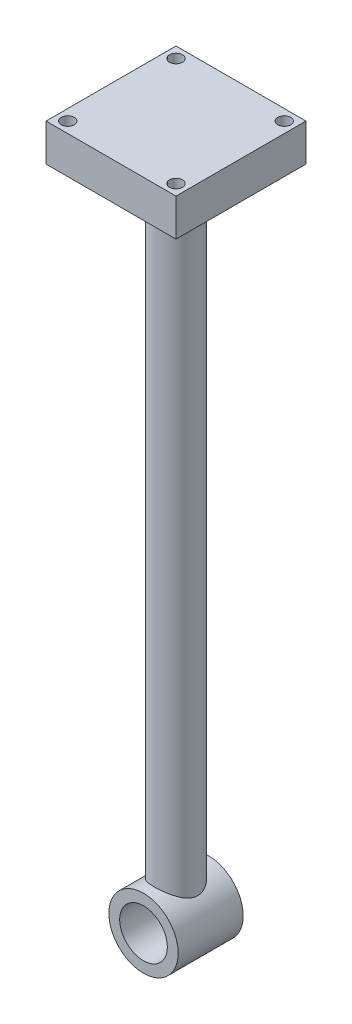
ISO-10303-21;
HEADER;
FILE_DESCRIPTION(('STEP AP214'),'2;1');
FILE_NAME('part.step','',(''),(''),'','','');
FILE_SCHEMA(('AUTOMOTIVE_DESIGN { 1 0 10303 214 1 1 1 1 }'));
ENDSEC;
DATA;
#1=APPLICATION_CONTEXT('core data for automotive mechanical design processes');
#2=APPLICATION_PROTOCOL_DEFINITION('international standard','automotive_design',2000,#1);
#3=PRODUCT_CONTEXT('',#1,'mechanical');
#4=PRODUCT('Part','Part','',(#3));
#5=PRODUCT_RELATED_PRODUCT_CATEGORY('part','',(#4));
#6=PRODUCT_DEFINITION_FORMATION('','',#4);
#7=PRODUCT_DEFINITION_CONTEXT('part definition',#1,'design');
#8=PRODUCT_DEFINITION('design','',#6,#7);
#9=PRODUCT_DEFINITION_SHAPE('','',#8);
#10=(LENGTH_UNIT() NAMED_UNIT(*) SI_UNIT(.MILLI.,.METRE.));
#11=(NAMED_UNIT(*) PLANE_ANGLE_UNIT() SI_UNIT($,.RADIAN.));
#12=(NAMED_UNIT(*) SI_UNIT($,.STERADIAN.) SOLID_ANGLE_UNIT());
#13=UNCERTAINTY_MEASURE_WITH_UNIT(LENGTH_MEASURE(1.E-05),#10,'distance_accuracy_value','');
#14=(GEOMETRIC_REPRESENTATION_CONTEXT(3) GLOBAL_UNCERTAINTY_ASSIGNED_CONTEXT((#13)) GLOBAL_UNIT_ASSIGNED_CONTEXT((#10,
#11,#12)) REPRESENTATION_CONTEXT('',''));
#15=CARTESIAN_POINT('',(0.,0.,0.));
#16=DIRECTION('',(0.,0.,1.));
#17=DIRECTION('',(1.,0.,0.));
#18=AXIS2_PLACEMENT_3D('',#15,#16,#17);
#19=CARTESIAN_POINT('',(0.,0.,7.5));
#20=DIRECTION('',(0.,0.,1.));
#21=DIRECTION('',(1.,0.,0.));
#22=AXIS2_PLACEMENT_3D('',#19,#20,#21);
#23=PLANE('',#22);
#24=CARTESIAN_POINT('',(0.,0.,7.5));
#25=DIRECTION('',(0.,0.,1.));
#26=DIRECTION('',(1.,0.,0.));
#27=AXIS2_PLACEMENT_3D('',#24,#25,#26);
#28=CIRCLE('',#27,8.);
#29=CARTESIAN_POINT('',(8.,0.,7.5));
#30=VERTEX_POINT('',#29);
#31=EDGE_CURVE('E11',#30,#30,#28,.T.);
#32=ORIENTED_EDGE('',*,*,#31,.T.);
#33=EDGE_LOOP('',(#32));
#34=FACE_BOUND('',#33,.T.);
#35=CARTESIAN_POINT('',(0.,0.,7.5));
#36=DIRECTION('',(0.,0.,1.));
#37=DIRECTION('',(1.,0.,0.));
#38=AXIS2_PLACEMENT_3D('',#35,#36,#37);
#39=CIRCLE('',#38,5.5);
#40=CARTESIAN_POINT('',(5.5,0.,7.5));
#41=VERTEX_POINT('',#40);
#42=EDGE_CURVE('E143',#41,#41,#39,.T.);
#43=ORIENTED_EDGE('',*,*,#42,.F.);
#44=EDGE_LOOP('',(#43));
#45=FACE_BOUND('',#44,.T.);
#46=ADVANCED_FACE('F39',(#34,#45),#23,.T.);
#47=CARTESIAN_POINT('',(0.,0.,-7.5));
#48=DIRECTION('',(0.,0.,1.));
#49=DIRECTION('',(1.,0.,0.));
#50=AXIS2_PLACEMENT_3D('',#47,#48,#49);
#51=PLANE('',#50);
#52=CARTESIAN_POINT('',(0.,0.,-7.5));
#53=DIRECTION('',(0.,0.,1.));
#54=DIRECTION('',(1.,0.,0.));
#55=AXIS2_PLACEMENT_3D('',#52,#53,#54);
#56=CIRCLE('',#55,8.);
#57=CARTESIAN_POINT('',(8.,0.,-7.5));
#58=VERTEX_POINT('',#57);
#59=EDGE_CURVE('E43',#58,#58,#56,.T.);
#60=ORIENTED_EDGE('',*,*,#59,.F.);
#61=EDGE_LOOP('',(#60));
#62=FACE_BOUND('',#61,.T.);
#63=CARTESIAN_POINT('',(0.,0.,-7.5));
#64=DIRECTION('',(0.,0.,1.));
#65=DIRECTION('',(1.,0.,0.));
#66=AXIS2_PLACEMENT_3D('',#63,#64,#65);
#67=CIRCLE('',#66,5.5);
#68=CARTESIAN_POINT('',(5.5,0.,-7.5));
#69=VERTEX_POINT('',#68);
#70=EDGE_CURVE('E142',#69,#69,#67,.T.);
#71=ORIENTED_EDGE('',*,*,#70,.T.);
#72=EDGE_LOOP('',(#71));
#73=FACE_BOUND('',#72,.T.);
#74=ADVANCED_FACE('F188',(#62,#73),#51,.F.);
#75=CARTESIAN_POINT('',(0.,0.,7.5));
#76=DIRECTION('',(0.,0.,-1.));
#77=DIRECTION('',(-1.,0.,0.));
#78=AXIS2_PLACEMENT_3D('',#75,#76,#77);
#79=CYLINDRICAL_SURFACE('',#78,8.);
#80=CARTESIAN_POINT('',(0.,8.,5.));
#81=CARTESIAN_POINT('',(0.127079718194144,7.99999969932037,4.999999703158));
#82=CARTESIAN_POINT('',(0.254165976353162,7.99696526438072,4.99514877169044));
#83=CARTESIAN_POINT('',(0.507365681398697,7.98490163345175,4.97581254301626));
#84=CARTESIAN_POINT('',(0.633478681463028,7.97586983252039,4.96132305932189));
#85=CARTESIAN_POINT('',(0.883879235580955,7.95201844653618,4.9228878347618));
#86=CARTESIAN_POINT('',(1.00816396386935,7.93719071559646,4.89892878436801));
#87=CARTESIAN_POINT('',(1.25388007858571,7.90210083284868,4.8418697843255));
#88=CARTESIAN_POINT('',(1.3753102342372,7.88183638204784,4.8087659675088));
#89=CARTESIAN_POINT('',(1.61383677448202,7.83646507337636,4.7340323987006));
#90=CARTESIAN_POINT('',(1.73095311667823,7.81138511664483,4.69244993505164));
#91=CARTESIAN_POINT('',(1.96091650164603,7.75685494898749,4.60110152475158));
#92=CARTESIAN_POINT('',(2.07376186971093,7.7274030455926,4.55133240807103));
#93=CARTESIAN_POINT('',(2.40491190911409,7.63340708241437,4.39050335799431));
#94=CARTESIAN_POINT('',(2.61609848167961,7.5631697348111,4.26783654975881));
#95=CARTESIAN_POINT('',(3.03193014433838,7.40680295707224,3.98444604696249));
#96=CARTESIAN_POINT('',(3.23470598963289,7.31985233528322,3.82146546344502));
#97=CARTESIAN_POINT('',(3.61195776992338,7.1412401292643,3.46710060830363));
#98=CARTESIAN_POINT('',(3.78639500697958,7.04957232454122,3.27567816902114));
#99=CARTESIAN_POINT('',(4.03551059577151,6.90836217121019,2.95571425020991));
#100=CARTESIAN_POINT('',(4.12074022592499,6.85772204075824,2.83571286902764));
#101=CARTESIAN_POINT('',(4.28074637131475,6.75899646823101,2.58784896365527));
#102=CARTESIAN_POINT('',(4.35552092872511,6.71091150568103,2.4599849735435));
#103=CARTESIAN_POINT('',(4.49385262588457,6.61907677956953,2.19711581232401));
#104=CARTESIAN_POINT('',(4.55742717693474,6.57532033426424,2.06212215723772));
#105=CARTESIAN_POINT('',(4.67278116226383,6.49385156056843,1.78537755230288));
#106=CARTESIAN_POINT('',(4.72456056034896,6.45613925072462,1.64362658172091));
#107=CARTESIAN_POINT('',(4.80367778250345,6.39737739560479,1.39186641707947));
#108=CARTESIAN_POINT('',(4.83387146386473,6.37454329188128,1.28316394558814));
#109=CARTESIAN_POINT('',(4.8869893698177,6.33391313113232,1.06308085312618));
#110=CARTESIAN_POINT('',(4.90991524122178,6.31611593289309,0.951700845020764));
#111=CARTESIAN_POINT('',(4.94817199977536,6.28619004435451,0.727023661660449));
#112=CARTESIAN_POINT('',(4.96351189515875,6.27405463174267,0.613728926331825));
#113=CARTESIAN_POINT('',(4.98640391146144,6.25587655110007,0.385858709185192));
#114=CARTESIAN_POINT('',(4.99395573327638,6.24983411707301,0.271283178348483));
#115=CARTESIAN_POINT('',(5.00115324292108,6.24407626191297,0.0414413461846044));
#116=CARTESIAN_POINT('',(5.00077951510321,6.24437637846302,-0.0738259597953579));
#117=CARTESIAN_POINT('',(4.99208386707443,6.2513301416873,-0.30390599351606));
#118=CARTESIAN_POINT('',(4.98375903270659,6.25798611784493,-0.418718539089884));
#119=CARTESIAN_POINT('',(4.95928874246478,6.27739584443856,-0.64702108197888));
#120=CARTESIAN_POINT('',(4.94314081984502,6.29015151819107,-0.760510650571557));
#121=CARTESIAN_POINT('',(4.90327193771259,6.32127805222651,-0.985386203178624));
#122=CARTESIAN_POINT('',(4.87954784440757,6.33965123599107,-1.09677129647281));
#123=CARTESIAN_POINT('',(4.79874186577055,6.40129934062341,-1.42161998429045));
#124=CARTESIAN_POINT('',(4.73140686716691,6.4516270932374,-1.63129247784869));
#125=CARTESIAN_POINT('',(4.57160139234777,6.565824165778,-2.03668208845984));
#126=CARTESIAN_POINT('',(4.47912202607653,6.62969827340046,-2.23239423873349));
#127=CARTESIAN_POINT('',(4.25180409904384,6.77818972806845,-2.64331465324919));
#128=CARTESIAN_POINT('',(4.1122797851601,6.86445305269834,-2.85533520228094));
#129=CARTESIAN_POINT('',(3.80349790123425,7.040239090172,-3.25534918374023));
#130=CARTESIAN_POINT('',(3.63420977102789,7.12976507734762,-3.44331757440197));
#131=CARTESIAN_POINT('',(3.34462792787133,7.26825220927601,-3.7195685480643));
#132=CARTESIAN_POINT('',(3.23332743959703,7.31856628212432,-3.81674280120393));
#133=CARTESIAN_POINT('',(3.00184758289934,7.4165140520612,-4.00135111278461));
#134=CARTESIAN_POINT('',(2.88167150233175,7.464148730294,-4.0887887482357));
#135=CARTESIAN_POINT('',(2.63291547069675,7.55548277586875,-4.25323322008513));
#136=CARTESIAN_POINT('',(2.50433330649266,7.59918109959603,-4.33023729302729));
#137=CARTESIAN_POINT('',(2.23953943503379,7.68138405457136,-4.47292528813083));
#138=CARTESIAN_POINT('',(2.10333250541061,7.71989188771747,-4.53861619614163));
#139=CARTESIAN_POINT('',(1.83158498937008,7.78870197133489,-4.65466886475307));
#140=CARTESIAN_POINT('',(1.69639792018988,7.81933279806533,-4.70566229777452));
#141=CARTESIAN_POINT('',(1.42097512774063,7.87404113157595,-4.79602098961896));
#142=CARTESIAN_POINT('',(1.28074233969552,7.89812238079521,-4.83539289010581));
#143=CARTESIAN_POINT('',(0.996484502868522,7.93899345279391,-4.90186739840658));
#144=CARTESIAN_POINT('',(0.852462989802589,7.95578983464414,-4.92898104411324));
#145=CARTESIAN_POINT('',(0.561915361707666,7.98157299247508,-4.97049034997301));
#146=CARTESIAN_POINT('',(0.415389678880742,7.99056110250213,-4.98488818263482));
#147=CARTESIAN_POINT('',(0.143238039189039,7.99969867025939,-4.999520164093));
#148=CARTESIAN_POINT('',(0.0177414078568131,8.00096292697891,-5.00154086408901));
#149=CARTESIAN_POINT('',(-0.232966367766397,7.99758945182604,-4.9961427784958));
#150=CARTESIAN_POINT('',(-0.358177530272757,7.9929521077216,-4.98872461309249));
#151=CARTESIAN_POINT('',(-0.607327834496613,7.97789005521255,-4.96455622247317));
#152=CARTESIAN_POINT('',(-0.731267089300075,7.96746586594014,-4.94780683435155));
#153=CARTESIAN_POINT('',(-0.976969695221644,7.94108300214141,-4.90520930732267));
#154=CARTESIAN_POINT('',(-1.09873300792335,7.92512423000295,-4.87936100793997));
#155=CARTESIAN_POINT('',(-1.33450834578852,7.88877344649023,-4.82009055280867));
#156=CARTESIAN_POINT('',(-1.44863666980924,7.86858112898481,-4.7870073558854));
#157=CARTESIAN_POINT('',(-1.67350231741757,7.82384532964923,-4.71311096735755));
#158=CARTESIAN_POINT('',(-1.78423846943478,7.79930036395891,-4.67229513929841));
#159=CARTESIAN_POINT('',(-2.11043845304158,7.7198451952159,-4.53885022306733));
#160=CARTESIAN_POINT('',(-2.32007565393525,7.65908557136377,-4.43517728812057));
#161=CARTESIAN_POINT('',(-2.74037159603304,7.51959499245698,-4.1899279363721));
#162=CARTESIAN_POINT('',(-2.94899750641245,7.43966908727208,-4.04558186341555));
#163=CARTESIAN_POINT('',(-3.34056091506499,7.27228030716763,-3.72882840333277));
#164=CARTESIAN_POINT('',(-3.52346945040511,7.1848091107345,-3.55638984261562));
#165=CARTESIAN_POINT('',(-3.88590040481163,6.99623419569616,-3.15945503308016));
#166=CARTESIAN_POINT('',(-4.06107692783136,6.89499476958427,-2.93103560865683));
#167=CARTESIAN_POINT('',(-4.37121122716532,6.70267107654715,-2.44451241557771));
#168=CARTESIAN_POINT('',(-4.50619684735976,6.61157980658315,-2.18642937021098));
#169=CARTESIAN_POINT('',(-4.70739703071134,6.46933988973206,-1.70118604230815));
#170=CARTESIAN_POINT('',(-4.78209607779641,6.41382106492076,-1.47888427189796));
#171=CARTESIAN_POINT('',(-4.87056932795047,6.34656596743547,-1.13643451168063));
#172=CARTESIAN_POINT('',(-4.89612834571373,6.32682054908637,-1.02080987665685));
#173=CARTESIAN_POINT('',(-4.93906627660446,6.29335959003546,-0.787213009902004));
#174=CARTESIAN_POINT('',(-4.95644870968554,6.27964145480505,-0.669241811186597));
#175=CARTESIAN_POINT('',(-4.98283345322303,6.25872646567769,-0.431062976531058));
#176=CARTESIAN_POINT('',(-4.99178464992502,6.25156939465669,-0.310846149194373));
#177=CARTESIAN_POINT('',(-5.00096567028373,6.24422754057757,-0.0698650772980854));
#178=CARTESIAN_POINT('',(-5.00119553239924,6.24404272677361,0.0508991648452125));
#179=CARTESIAN_POINT('',(-4.99292458618068,6.25065867247708,0.29197552581112));
#180=CARTESIAN_POINT('',(-4.98442112542226,6.2574615542391,0.412287496131265));
#181=CARTESIAN_POINT('',(-4.95884706925013,6.27774556876195,0.65139366298223));
#182=CARTESIAN_POINT('',(-4.94177659470706,6.2912266073017,0.770187880902528));
#183=CARTESIAN_POINT('',(-4.88153513763474,6.33822773980263,1.10397138997807));
#184=CARTESIAN_POINT('',(-4.82847742875036,6.37907576446225,1.3162377600251));
#185=CARTESIAN_POINT('',(-4.69670428935884,6.47669777004122,1.728579701154));
#186=CARTESIAN_POINT('',(-4.61797815957074,6.53347839071251,1.92865014730156));
#187=CARTESIAN_POINT('',(-4.42410573147435,6.66655793133305,2.34237556307301));
#188=CARTESIAN_POINT('',(-4.30533683658203,6.74449249142917,2.55380395596852));
#189=CARTESIAN_POINT('',(-4.04000963034607,6.90670498235136,2.9557507046809));
#190=CARTESIAN_POINT('',(-3.89342885237777,6.99098800808705,3.14625195760182));
#191=CARTESIAN_POINT('',(-3.54264024371939,7.17608994782601,3.54008396920719));
#192=CARTESIAN_POINT('',(-3.33276887019885,7.27687640364452,3.73847789009048));
#193=CARTESIAN_POINT('',(-2.99268031590093,7.42018359046303,4.00810023016021));
#194=CARTESIAN_POINT('',(-2.87498419390476,7.4666796252241,4.09337831825354));
#195=CARTESIAN_POINT('',(-2.63162062416605,7.55588019054725,4.25391486002553));
#196=CARTESIAN_POINT('',(-2.50595739502896,7.59858669939735,4.32917855200335));
#197=CARTESIAN_POINT('',(-2.24695585117553,7.67916888890582,4.46910627052635));
#198=CARTESIAN_POINT('',(-2.11359966396133,7.71703260409719,4.53374415122623));
#199=CARTESIAN_POINT('',(-1.8403912735063,7.78670745066037,4.65135006079645));
#200=CARTESIAN_POINT('',(-1.70054287903653,7.81852207637899,4.70432482984781));
#201=CARTESIAN_POINT('',(-1.415749691869,7.87506644788238,4.79771288731285));
#202=CARTESIAN_POINT('',(-1.27081981592251,7.89981525263675,4.83815999270725));
#203=CARTESIAN_POINT('',(-0.976912453464884,7.9415135957936,4.90595103285879));
#204=CARTESIAN_POINT('',(-0.827938038321416,7.95846888622183,4.93330463193523));
#205=CARTESIAN_POINT('',(-0.565708034628111,7.98076605772891,4.96918150103186));
#206=CARTESIAN_POINT('',(-0.453012043961128,7.98796542217808,4.98072550400174));
#207=CARTESIAN_POINT('',(-0.226879136348951,7.99758267549434,4.99613512360569));
#208=CARTESIAN_POINT('',(-0.113442173980088,8.00000026841223,5.00000026498644));
#209=CARTESIAN_POINT('',(0.,8.,5.));
#210=B_SPLINE_CURVE_WITH_KNOTS('',3,(#80,#81,#82,#83,#84,#85,#86,#87,#88,#89,#90,#91,#92,#93,
#94,#95,#96,#97,#98,#99,#100,#101,#102,#103,#104,#105,#106,#107,#108,#109,#110,#111,#112,#113,
#114,#115,#116,#117,#118,#119,#120,#121,#122,#123,#124,#125,#126,#127,#128,#129,#130,#131,#132,
#133,#134,#135,#136,#137,#138,#139,#140,#141,#142,#143,#144,#145,#146,#147,#148,#149,#150,#151,
#152,#153,#154,#155,#156,#157,#158,#159,#160,#161,#162,#163,#164,#165,#166,#167,#168,#169,#170,
#171,#172,#173,#174,#175,#176,#177,#178,#179,#180,#181,#182,#183,#184,#185,#186,#187,#188,#189,
#190,#191,#192,#193,#194,#195,#196,#197,#198,#199,#200,#201,#202,#203,#204,#205,#206,#207,#208,
#209),.UNSPECIFIED.,.T.,.F.,(4,2,2,2,2,2,2,2,2,2,2,2,2,2,2,2,2,2,2,2,2,2,2,2,2,2,2,2,2,2,2,2,2,
2,2,2,2,2,2,2,2,2,2,2,2,2,2,2,2,2,2,2,2,2,2,2,2,2,2,2,2,2,2,2,4),(0.,0.381122813878229,
0.762411275945245,1.14423755771083,1.52622555522555,1.90613865065076,2.2861992035346,
3.04547146930923,3.86537873527685,4.68639638614618,5.15288943324734,5.61946971957747,
6.08531814323784,6.55116799634915,6.89615022205285,7.24105422230075,7.58554766475416,
7.93005433713581,8.27540506342305,8.62088241265912,8.96646876744118,9.31219825544432,
9.98712845371038,10.6622975916544,11.463592889512,12.2657157783383,12.7334704505957,
13.2010527095967,13.6687585723722,14.1361745843372,14.5786070973028,15.0207862699487,
15.4625664873666,15.9042712116064,16.280349331717,16.6564027426817,17.0324224237136,
17.4084487368524,17.7696430642803,18.1309607639224,18.8530325398091,19.6479898222925,
20.4438353357779,21.355208937219,22.2659496705469,22.9857781952855,23.3455439181714,
23.705154622762,24.0669316687913,24.4287071194786,24.7905924786018,25.1524727320855,
25.8172983911075,26.482401522191,27.2437925511324,28.005801275804,28.9187931910577,
29.3761295657642,29.8332257699805,30.2914303932663,30.7493695182481,31.2060614935588,
31.6624158626753,32.0026174741983,32.3428401405226),.UNSPECIFIED.);
#211=CARTESIAN_POINT('',(0.,8.,5.));
#212=VERTEX_POINT('',#211);
#213=EDGE_CURVE('E133',#212,#212,#210,.T.);
#214=ORIENTED_EDGE('',*,*,#213,.F.);
#215=EDGE_LOOP('',(#214));
#216=FACE_BOUND('',#215,.T.);
#217=ORIENTED_EDGE('',*,*,#31,.F.);
#218=EDGE_LOOP('',(#217));
#219=FACE_BOUND('',#218,.T.);
#220=ORIENTED_EDGE('',*,*,#59,.T.);
#221=EDGE_LOOP('',(#220));
#222=FACE_BOUND('',#221,.T.);
#223=ADVANCED_FACE('F41',(#216,#219,#222),#79,.T.);
#224=CARTESIAN_POINT('',(0.,0.,7.5));
#225=DIRECTION('',(0.,0.,-1.));
#226=DIRECTION('',(-1.,0.,0.));
#227=AXIS2_PLACEMENT_3D('',#224,#225,#226);
#228=CYLINDRICAL_SURFACE('',#227,5.5);
#229=ORIENTED_EDGE('',*,*,#42,.T.);
#230=EDGE_LOOP('',(#229));
#231=FACE_BOUND('',#230,.T.);
#232=ORIENTED_EDGE('',*,*,#70,.F.);
#233=EDGE_LOOP('',(#232));
#234=FACE_BOUND('',#233,.T.);
#235=ADVANCED_FACE('F196',(#231,#234),#228,.F.);
#236=CARTESIAN_POINT('',(0.,-8.00100000000001,0.));
#237=DIRECTION('',(0.,1.,0.));
#238=DIRECTION('',(0.,0.,1.));
#239=AXIS2_PLACEMENT_3D('',#236,#237,#238);
#240=CYLINDRICAL_SURFACE('',#239,5.);
#241=CARTESIAN_POINT('',(0.,150.,0.));
#242=DIRECTION('',(0.,1.,0.));
#243=DIRECTION('',(0.,0.,1.));
#244=AXIS2_PLACEMENT_3D('',#241,#242,#243);
#245=CIRCLE('',#244,5.);
#246=CARTESIAN_POINT('',(0.,150.,5.));
#247=VERTEX_POINT('',#246);
#248=EDGE_CURVE('E117',#247,#247,#245,.T.);
#249=ORIENTED_EDGE('',*,*,#248,.F.);
#250=EDGE_LOOP('',(#249));
#251=FACE_BOUND('',#250,.T.);
#252=ORIENTED_EDGE('',*,*,#213,.T.);
#253=EDGE_LOOP('',(#252));
#254=FACE_BOUND('',#253,.T.);
#255=ADVANCED_FACE('F145',(#251,#254),#240,.T.);
#256=CARTESIAN_POINT('',(15.,201.037419011004,-15.));
#257=DIRECTION('',(-1.,0.,0.));
#258=DIRECTION('',(0.,0.,1.));
#259=AXIS2_PLACEMENT_3D('',#256,#257,#258);
#260=PLANE('',#259);
#261=DIRECTION('',(0.,0.,-1.));
#262=VECTOR('',#261,1.);
#263=CARTESIAN_POINT('',(15.,158.611012139811,-15.));
#264=LINE('',#263,#262);
#265=CARTESIAN_POINT('',(15.,158.611012139811,15.));
#266=VERTEX_POINT('',#265);
#267=CARTESIAN_POINT('',(15.,158.611012139811,-15.));
#268=VERTEX_POINT('',#267);
#269=EDGE_CURVE('E91',#266,#268,#264,.T.);
#270=ORIENTED_EDGE('',*,*,#269,.F.);
#271=DIRECTION('',(0.,-1.,0.));
#272=VECTOR('',#271,1.);
#273=CARTESIAN_POINT('',(15.,201.037419011004,15.));
#274=LINE('',#273,#272);
#275=CARTESIAN_POINT('',(15.,150.,15.));
#276=VERTEX_POINT('',#275);
#277=EDGE_CURVE('E55',#266,#276,#274,.T.);
#278=ORIENTED_EDGE('',*,*,#277,.T.);
#279=DIRECTION('',(0.,0.,-1.));
#280=VECTOR('',#279,1.);
#281=CARTESIAN_POINT('',(15.,150.,-15.));
#282=LINE('',#281,#280);
#283=CARTESIAN_POINT('',(15.,150.,-15.));
#284=VERTEX_POINT('',#283);
#285=EDGE_CURVE('E89',#276,#284,#282,.T.);
#286=ORIENTED_EDGE('',*,*,#285,.T.);
#287=DIRECTION('',(0.,-1.,0.));
#288=VECTOR('',#287,1.);
#289=CARTESIAN_POINT('',(15.,201.037419011004,-15.));
#290=LINE('',#289,#288);
#291=EDGE_CURVE('E78',#268,#284,#290,.T.);
#292=ORIENTED_EDGE('',*,*,#291,.F.);
#293=EDGE_LOOP('',(#270,#278,#286,#292));
#294=FACE_BOUND('',#293,.T.);
#295=ADVANCED_FACE('F87',(#294),#260,.F.);
#296=CARTESIAN_POINT('',(-15.,201.037419011004,-15.));
#297=DIRECTION('',(0.,0.,1.));
#298=DIRECTION('',(1.,0.,0.));
#299=AXIS2_PLACEMENT_3D('',#296,#297,#298);
#300=PLANE('',#299);
#301=DIRECTION('',(-1.,0.,0.));
#302=VECTOR('',#301,1.);
#303=CARTESIAN_POINT('',(-15.,158.611012139811,-15.));
#304=LINE('',#303,#302);
#305=CARTESIAN_POINT('',(-15.,158.611012139811,-15.));
#306=VERTEX_POINT('',#305);
#307=EDGE_CURVE('E84',#268,#306,#304,.T.);
#308=ORIENTED_EDGE('',*,*,#307,.F.);
#309=ORIENTED_EDGE('',*,*,#291,.T.);
#310=DIRECTION('',(-1.,0.,0.));
#311=VECTOR('',#310,1.);
#312=CARTESIAN_POINT('',(-15.,150.,-15.));
#313=LINE('',#312,#311);
#314=CARTESIAN_POINT('',(-15.,150.,-15.));
#315=VERTEX_POINT('',#314);
#316=EDGE_CURVE('E105',#284,#315,#313,.T.);
#317=ORIENTED_EDGE('',*,*,#316,.T.);
#318=DIRECTION('',(0.,-1.,0.));
#319=VECTOR('',#318,1.);
#320=CARTESIAN_POINT('',(-15.,201.037419011004,-15.));
#321=LINE('',#320,#319);
#322=EDGE_CURVE('E124',#306,#315,#321,.T.);
#323=ORIENTED_EDGE('',*,*,#322,.F.);
#324=EDGE_LOOP('',(#308,#309,#317,#323));
#325=FACE_BOUND('',#324,.T.);
#326=ADVANCED_FACE('F157',(#325),#300,.F.);
#327=CARTESIAN_POINT('',(-15.,201.037419011004,-15.));
#328=DIRECTION('',(1.,0.,0.));
#329=DIRECTION('',(0.,0.,-1.));
#330=AXIS2_PLACEMENT_3D('',#327,#328,#329);
#331=PLANE('',#330);
#332=DIRECTION('',(0.,0.,1.));
#333=VECTOR('',#332,1.);
#334=CARTESIAN_POINT('',(-15.,158.611012139811,-15.));
#335=LINE('',#334,#333);
#336=CARTESIAN_POINT('',(-15.,158.611012139811,15.));
#337=VERTEX_POINT('',#336);
#338=EDGE_CURVE('E113',#306,#337,#335,.T.);
#339=ORIENTED_EDGE('',*,*,#338,.F.);
#340=ORIENTED_EDGE('',*,*,#322,.T.);
#341=DIRECTION('',(0.,0.,1.));
#342=VECTOR('',#341,1.);
#343=CARTESIAN_POINT('',(-15.,150.,-15.));
#344=LINE('',#343,#342);
#345=CARTESIAN_POINT('',(-15.,150.,15.));
#346=VERTEX_POINT('',#345);
#347=EDGE_CURVE('E127',#315,#346,#344,.T.);
#348=ORIENTED_EDGE('',*,*,#347,.T.);
#349=DIRECTION('',(0.,-1.,0.));
#350=VECTOR('',#349,1.);
#351=CARTESIAN_POINT('',(-15.,201.037419011004,15.));
#352=LINE('',#351,#350);
#353=EDGE_CURVE('E61',#337,#346,#352,.T.);
#354=ORIENTED_EDGE('',*,*,#353,.F.);
#355=EDGE_LOOP('',(#339,#340,#348,#354));
#356=FACE_BOUND('',#355,.T.);
#357=ADVANCED_FACE('F160',(#356),#331,.F.);
#358=CARTESIAN_POINT('',(-15.,201.037419011004,15.));
#359=DIRECTION('',(0.,0.,-1.));
#360=DIRECTION('',(-1.,0.,0.));
#361=AXIS2_PLACEMENT_3D('',#358,#359,#360);
#362=PLANE('',#361);
#363=DIRECTION('',(1.,0.,0.));
#364=VECTOR('',#363,1.);
#365=CARTESIAN_POINT('',(-15.,158.611012139811,15.));
#366=LINE('',#365,#364);
#367=EDGE_CURVE('E102',#337,#266,#366,.T.);
#368=ORIENTED_EDGE('',*,*,#367,.F.);
#369=ORIENTED_EDGE('',*,*,#353,.T.);
#370=DIRECTION('',(1.,0.,0.));
#371=VECTOR('',#370,1.);
#372=CARTESIAN_POINT('',(-15.,150.,15.));
#373=LINE('',#372,#371);
#374=EDGE_CURVE('E97',#346,#276,#373,.T.);
#375=ORIENTED_EDGE('',*,*,#374,.T.);
#376=ORIENTED_EDGE('',*,*,#277,.F.);
#377=EDGE_LOOP('',(#368,#369,#375,#376));
#378=FACE_BOUND('',#377,.T.);
#379=ADVANCED_FACE('F98',(#378),#362,.F.);
#380=CARTESIAN_POINT('',(0.,150.,0.));
#381=DIRECTION('',(0.,1.,0.));
#382=DIRECTION('',(0.,0.,1.));
#383=AXIS2_PLACEMENT_3D('',#380,#381,#382);
#384=PLANE('',#383);
#385=CARTESIAN_POINT('',(12.5,150.,-12.5000000000001));
#386=DIRECTION('',(0.,1.,0.));
#387=DIRECTION('',(0.,0.,1.));
#388=AXIS2_PLACEMENT_3D('',#385,#386,#387);
#389=CIRCLE('',#388,1.5);
#390=CARTESIAN_POINT('',(12.5,150.,-11.0000000000001));
#391=VERTEX_POINT('',#390);
#392=EDGE_CURVE('E94',#391,#391,#389,.T.);
#393=ORIENTED_EDGE('',*,*,#392,.T.);
#394=EDGE_LOOP('',(#393));
#395=FACE_BOUND('',#394,.T.);
#396=CARTESIAN_POINT('',(-12.5,150.,12.4999999999999));
#397=DIRECTION('',(0.,1.,0.));
#398=DIRECTION('',(0.,0.,1.));
#399=AXIS2_PLACEMENT_3D('',#396,#397,#398);
#400=CIRCLE('',#399,1.5);
#401=CARTESIAN_POINT('',(-12.5,150.,13.9999999999999));
#402=VERTEX_POINT('',#401);
#403=EDGE_CURVE('E224',#402,#402,#400,.T.);
#404=ORIENTED_EDGE('',*,*,#403,.T.);
#405=EDGE_LOOP('',(#404));
#406=FACE_BOUND('',#405,.T.);
#407=CARTESIAN_POINT('',(-12.5,150.,-12.5000000000001));
#408=DIRECTION('',(0.,1.,0.));
#409=DIRECTION('',(0.,0.,1.));
#410=AXIS2_PLACEMENT_3D('',#407,#408,#409);
#411=CIRCLE('',#410,1.5);
#412=CARTESIAN_POINT('',(-12.5,150.,-11.0000000000001));
#413=VERTEX_POINT('',#412);
#414=EDGE_CURVE('E228',#413,#413,#411,.T.);
#415=ORIENTED_EDGE('',*,*,#414,.T.);
#416=EDGE_LOOP('',(#415));
#417=FACE_BOUND('',#416,.T.);
#418=CARTESIAN_POINT('',(12.5,150.,12.4999999999999));
#419=DIRECTION('',(0.,1.,0.));
#420=DIRECTION('',(0.,0.,1.));
#421=AXIS2_PLACEMENT_3D('',#418,#419,#420);
#422=CIRCLE('',#421,1.5);
#423=CARTESIAN_POINT('',(12.5,150.,13.9999999999999));
#424=VERTEX_POINT('',#423);
#425=EDGE_CURVE('E232',#424,#424,#422,.T.);
#426=ORIENTED_EDGE('',*,*,#425,.T.);
#427=EDGE_LOOP('',(#426));
#428=FACE_BOUND('',#427,.T.);
#429=ORIENTED_EDGE('',*,*,#248,.T.);
#430=EDGE_LOOP('',(#429));
#431=FACE_BOUND('',#430,.T.);
#432=ORIENTED_EDGE('',*,*,#285,.F.);
#433=ORIENTED_EDGE('',*,*,#374,.F.);
#434=ORIENTED_EDGE('',*,*,#347,.F.);
#435=ORIENTED_EDGE('',*,*,#316,.F.);
#436=EDGE_LOOP('',(#432,#433,#434,#435));
#437=FACE_BOUND('',#436,.T.);
#438=ADVANCED_FACE('F104',(#395,#406,#417,#428,#431,#437),#384,.F.);
#439=CARTESIAN_POINT('',(136.423585861757,158.611012139811,246.667415515133));
#440=DIRECTION('',(0.,1.,0.));
#441=DIRECTION('',(0.,0.,1.));
#442=AXIS2_PLACEMENT_3D('',#439,#440,#441);
#443=PLANE('',#442);
#444=CARTESIAN_POINT('',(12.5,158.611012139811,-12.5000000000001));
#445=DIRECTION('',(0.,1.,0.));
#446=DIRECTION('',(0.,0.,-1.));
#447=AXIS2_PLACEMENT_3D('',#444,#445,#446);
#448=CIRCLE('',#447,1.5);
#449=CARTESIAN_POINT('',(12.5,158.611012139811,-14.0000000000001));
#450=VERTEX_POINT('',#449);
#451=EDGE_CURVE('E240',#450,#450,#448,.T.);
#452=ORIENTED_EDGE('',*,*,#451,.F.);
#453=EDGE_LOOP('',(#452));
#454=FACE_BOUND('',#453,.T.);
#455=CARTESIAN_POINT('',(-12.5,158.611012139811,12.4999999999999));
#456=DIRECTION('',(0.,1.,0.));
#457=DIRECTION('',(0.,0.,-1.));
#458=AXIS2_PLACEMENT_3D('',#455,#456,#457);
#459=CIRCLE('',#458,1.5);
#460=CARTESIAN_POINT('',(-12.5,158.611012139811,10.9999999999999));
#461=VERTEX_POINT('',#460);
#462=EDGE_CURVE('E241',#461,#461,#459,.T.);
#463=ORIENTED_EDGE('',*,*,#462,.F.);
#464=EDGE_LOOP('',(#463));
#465=FACE_BOUND('',#464,.T.);
#466=CARTESIAN_POINT('',(-12.5,158.611012139811,-12.5000000000001));
#467=DIRECTION('',(0.,1.,0.));
#468=DIRECTION('',(0.,0.,1.));
#469=AXIS2_PLACEMENT_3D('',#466,#467,#468);
#470=CIRCLE('',#469,1.5);
#471=CARTESIAN_POINT('',(-12.5,158.611012139811,-11.0000000000001));
#472=VERTEX_POINT('',#471);
#473=EDGE_CURVE('E245',#472,#472,#470,.T.);
#474=ORIENTED_EDGE('',*,*,#473,.F.);
#475=EDGE_LOOP('',(#474));
#476=FACE_BOUND('',#475,.T.);
#477=CARTESIAN_POINT('',(12.5,158.611012139811,12.4999999999999));
#478=DIRECTION('',(0.,1.,0.));
#479=DIRECTION('',(0.,0.,1.));
#480=AXIS2_PLACEMENT_3D('',#477,#478,#479);
#481=CIRCLE('',#480,1.5);
#482=CARTESIAN_POINT('',(12.5,158.611012139811,13.9999999999999));
#483=VERTEX_POINT('',#482);
#484=EDGE_CURVE('E236',#483,#483,#481,.T.);
#485=ORIENTED_EDGE('',*,*,#484,.F.);
#486=EDGE_LOOP('',(#485));
#487=FACE_BOUND('',#486,.T.);
#488=ORIENTED_EDGE('',*,*,#367,.T.);
#489=ORIENTED_EDGE('',*,*,#269,.T.);
#490=ORIENTED_EDGE('',*,*,#307,.T.);
#491=ORIENTED_EDGE('',*,*,#338,.T.);
#492=EDGE_LOOP('',(#488,#489,#490,#491));
#493=FACE_BOUND('',#492,.T.);
#494=ADVANCED_FACE('F150',(#454,#465,#476,#487,#493),#443,.T.);
#495=CARTESIAN_POINT('',(12.5,148.611012139811,12.4999999999999));
#496=DIRECTION('',(0.,1.,0.));
#497=DIRECTION('',(0.,0.,1.));
#498=AXIS2_PLACEMENT_3D('',#495,#496,#497);
#499=CYLINDRICAL_SURFACE('',#498,1.5);
#500=ORIENTED_EDGE('',*,*,#484,.T.);
#501=EDGE_LOOP('',(#500));
#502=FACE_BOUND('',#501,.T.);
#503=ORIENTED_EDGE('',*,*,#425,.F.);
#504=EDGE_LOOP('',(#503));
#505=FACE_BOUND('',#504,.T.);
#506=ADVANCED_FACE('F153',(#502,#505),#499,.F.);
#507=CARTESIAN_POINT('',(-12.5,148.611012139811,-12.5000000000001));
#508=DIRECTION('',(0.,1.,0.));
#509=DIRECTION('',(0.,0.,1.));
#510=AXIS2_PLACEMENT_3D('',#507,#508,#509);
#511=CYLINDRICAL_SURFACE('',#510,1.5);
#512=ORIENTED_EDGE('',*,*,#473,.T.);
#513=EDGE_LOOP('',(#512));
#514=FACE_BOUND('',#513,.T.);
#515=ORIENTED_EDGE('',*,*,#414,.F.);
#516=EDGE_LOOP('',(#515));
#517=FACE_BOUND('',#516,.T.);
#518=ADVANCED_FACE('F171',(#514,#517),#511,.F.);
#519=CARTESIAN_POINT('',(-12.5,148.611012139811,12.4999999999999));
#520=DIRECTION('',(0.,1.,0.));
#521=DIRECTION('',(0.,0.,1.));
#522=AXIS2_PLACEMENT_3D('',#519,#520,#521);
#523=CYLINDRICAL_SURFACE('',#522,1.5);
#524=ORIENTED_EDGE('',*,*,#462,.T.);
#525=EDGE_LOOP('',(#524));
#526=FACE_BOUND('',#525,.T.);
#527=ORIENTED_EDGE('',*,*,#403,.F.);
#528=EDGE_LOOP('',(#527));
#529=FACE_BOUND('',#528,.T.);
#530=ADVANCED_FACE('F173',(#526,#529),#523,.F.);
#531=CARTESIAN_POINT('',(12.5,148.611012139811,-12.5000000000001));
#532=DIRECTION('',(0.,1.,0.));
#533=DIRECTION('',(0.,0.,1.));
#534=AXIS2_PLACEMENT_3D('',#531,#532,#533);
#535=CYLINDRICAL_SURFACE('',#534,1.5);
#536=ORIENTED_EDGE('',*,*,#451,.T.);
#537=EDGE_LOOP('',(#536));
#538=FACE_BOUND('',#537,.T.);
#539=ORIENTED_EDGE('',*,*,#392,.F.);
#540=EDGE_LOOP('',(#539));
#541=FACE_BOUND('',#540,.T.);
#542=ADVANCED_FACE('F176',(#538,#541),#535,.F.);
#543=CLOSED_SHELL('',(#46,#74,#223,#235,#255,#295,#326,#357,#379,#438,#494,#506,#518,#530,#542));
#544=MANIFOLD_SOLID_BREP('B2',#543);
#545=ADVANCED_BREP_SHAPE_REPRESENTATION('',(#18,#544),#14);
#546=SHAPE_DEFINITION_REPRESENTATION(#9,#545);
ENDSEC;
END-ISO-10303-21;
